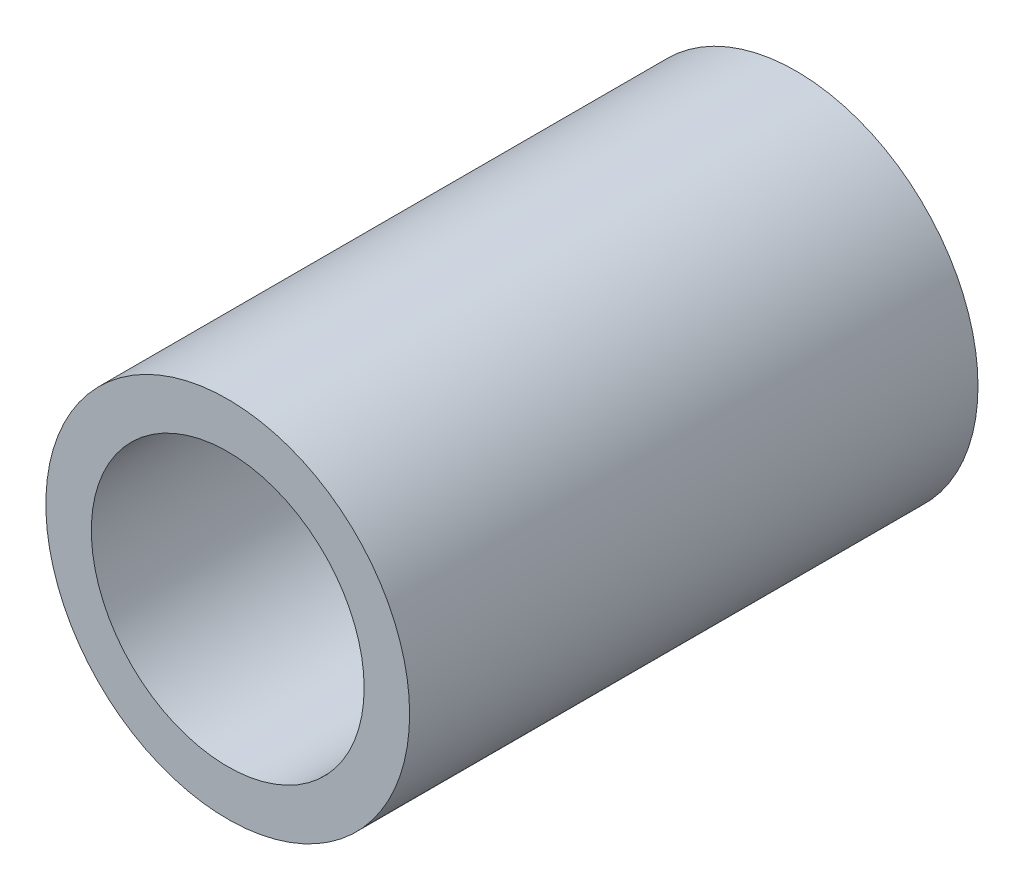
ISO-10303-21;
HEADER;
FILE_DESCRIPTION(('STEP AP214'),'2;1');
FILE_NAME('part.step','',(''),(''),'','','');
FILE_SCHEMA(('AUTOMOTIVE_DESIGN { 1 0 10303 214 1 1 1 1 }'));
ENDSEC;
DATA;
#1=APPLICATION_CONTEXT('core data for automotive mechanical design processes');
#2=APPLICATION_PROTOCOL_DEFINITION('international standard','automotive_design',2000,#1);
#3=PRODUCT_CONTEXT('',#1,'mechanical');
#4=PRODUCT('Part','Part','',(#3));
#5=PRODUCT_RELATED_PRODUCT_CATEGORY('part','',(#4));
#6=PRODUCT_DEFINITION_FORMATION('','',#4);
#7=PRODUCT_DEFINITION_CONTEXT('part definition',#1,'design');
#8=PRODUCT_DEFINITION('design','',#6,#7);
#9=PRODUCT_DEFINITION_SHAPE('','',#8);
#10=(LENGTH_UNIT() NAMED_UNIT(*) SI_UNIT(.MILLI.,.METRE.));
#11=(NAMED_UNIT(*) PLANE_ANGLE_UNIT() SI_UNIT($,.RADIAN.));
#12=(NAMED_UNIT(*) SI_UNIT($,.STERADIAN.) SOLID_ANGLE_UNIT());
#13=UNCERTAINTY_MEASURE_WITH_UNIT(LENGTH_MEASURE(1.E-05),#10,'distance_accuracy_value','');
#14=(GEOMETRIC_REPRESENTATION_CONTEXT(3) GLOBAL_UNCERTAINTY_ASSIGNED_CONTEXT((#13)) GLOBAL_UNIT_ASSIGNED_CONTEXT((#10,
#11,#12)) REPRESENTATION_CONTEXT('',''));
#15=CARTESIAN_POINT('',(0.,0.,0.));
#16=DIRECTION('',(0.,0.,1.));
#17=DIRECTION('',(1.,0.,0.));
#18=AXIS2_PLACEMENT_3D('',#15,#16,#17);
#19=CARTESIAN_POINT('',(0.,0.,25.));
#20=DIRECTION('',(0.,0.,1.));
#21=DIRECTION('',(1.,0.,0.));
#22=AXIS2_PLACEMENT_3D('',#19,#20,#21);
#23=PLANE('',#22);
#24=CARTESIAN_POINT('',(0.,0.,25.));
#25=DIRECTION('',(0.,0.,1.));
#26=DIRECTION('',(1.,0.,0.));
#27=AXIS2_PLACEMENT_3D('',#24,#25,#26);
#28=CIRCLE('',#27,8.);
#29=CARTESIAN_POINT('',(8.,0.,25.));
#30=VERTEX_POINT('',#29);
#31=EDGE_CURVE('E10',#30,#30,#28,.T.);
#32=ORIENTED_EDGE('',*,*,#31,.T.);
#33=EDGE_LOOP('',(#32));
#34=FACE_BOUND('',#33,.T.);
#35=CARTESIAN_POINT('',(0.,0.,25.));
#36=DIRECTION('',(0.,0.,1.));
#37=DIRECTION('',(1.,0.,0.));
#38=AXIS2_PLACEMENT_3D('',#35,#36,#37);
#39=CIRCLE('',#38,6.);
#40=CARTESIAN_POINT('',(6.,0.,25.));
#41=VERTEX_POINT('',#40);
#42=EDGE_CURVE('E56',#41,#41,#39,.T.);
#43=ORIENTED_EDGE('',*,*,#42,.F.);
#44=EDGE_LOOP('',(#43));
#45=FACE_BOUND('',#44,.T.);
#46=ADVANCED_FACE('F43',(#34,#45),#23,.T.);
#47=CARTESIAN_POINT('',(0.,0.,0.));
#48=DIRECTION('',(0.,0.,1.));
#49=DIRECTION('',(1.,0.,0.));
#50=AXIS2_PLACEMENT_3D('',#47,#48,#49);
#51=PLANE('',#50);
#52=CARTESIAN_POINT('',(0.,0.,0.));
#53=DIRECTION('',(0.,0.,1.));
#54=DIRECTION('',(1.,0.,0.));
#55=AXIS2_PLACEMENT_3D('',#52,#53,#54);
#56=CIRCLE('',#55,8.);
#57=CARTESIAN_POINT('',(8.,0.,0.));
#58=VERTEX_POINT('',#57);
#59=EDGE_CURVE('E47',#58,#58,#56,.T.);
#60=ORIENTED_EDGE('',*,*,#59,.F.);
#61=EDGE_LOOP('',(#60));
#62=FACE_BOUND('',#61,.T.);
#63=CARTESIAN_POINT('',(0.,0.,0.));
#64=DIRECTION('',(0.,0.,1.));
#65=DIRECTION('',(1.,0.,0.));
#66=AXIS2_PLACEMENT_3D('',#63,#64,#65);
#67=CIRCLE('',#66,6.);
#68=CARTESIAN_POINT('',(6.,0.,0.));
#69=VERTEX_POINT('',#68);
#70=EDGE_CURVE('E58',#69,#69,#67,.T.);
#71=ORIENTED_EDGE('',*,*,#70,.T.);
#72=EDGE_LOOP('',(#71));
#73=FACE_BOUND('',#72,.T.);
#74=ADVANCED_FACE('F70',(#62,#73),#51,.F.);
#75=CARTESIAN_POINT('',(0.,0.,25.));
#76=DIRECTION('',(0.,0.,-1.));
#77=DIRECTION('',(-1.,0.,0.));
#78=AXIS2_PLACEMENT_3D('',#75,#76,#77);
#79=CYLINDRICAL_SURFACE('',#78,8.);
#80=ORIENTED_EDGE('',*,*,#31,.F.);
#81=EDGE_LOOP('',(#80));
#82=FACE_BOUND('',#81,.T.);
#83=ORIENTED_EDGE('',*,*,#59,.T.);
#84=EDGE_LOOP('',(#83));
#85=FACE_BOUND('',#84,.T.);
#86=ADVANCED_FACE('F45',(#82,#85),#79,.T.);
#87=CARTESIAN_POINT('',(0.,0.,25.));
#88=DIRECTION('',(0.,0.,-1.));
#89=DIRECTION('',(-1.,0.,0.));
#90=AXIS2_PLACEMENT_3D('',#87,#88,#89);
#91=CYLINDRICAL_SURFACE('',#90,6.);
#92=ORIENTED_EDGE('',*,*,#42,.T.);
#93=EDGE_LOOP('',(#92));
#94=FACE_BOUND('',#93,.T.);
#95=ORIENTED_EDGE('',*,*,#70,.F.);
#96=EDGE_LOOP('',(#95));
#97=FACE_BOUND('',#96,.T.);
#98=ADVANCED_FACE('F66',(#94,#97),#91,.F.);
#99=CLOSED_SHELL('',(#46,#74,#86,#98));
#100=MANIFOLD_SOLID_BREP('B2',#99);
#101=ADVANCED_BREP_SHAPE_REPRESENTATION('',(#18,#100),#14);
#102=SHAPE_DEFINITION_REPRESENTATION(#9,#101);
ENDSEC;
END-ISO-10303-21;
